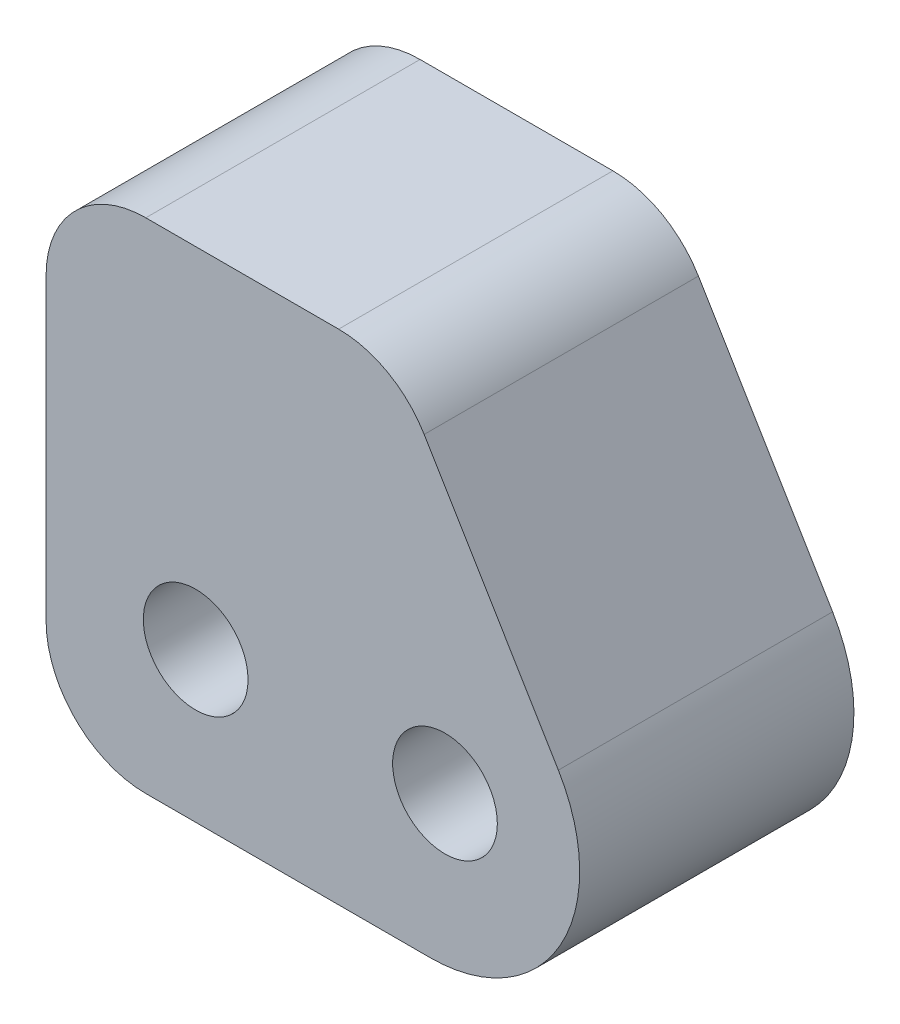
ISO-10303-21;
HEADER;
FILE_DESCRIPTION(('STEP AP214'),'2;1');
FILE_NAME('part.step','',(''),(''),'','','');
FILE_SCHEMA(('AUTOMOTIVE_DESIGN { 1 0 10303 214 1 1 1 1 }'));
ENDSEC;
DATA;
#1=APPLICATION_CONTEXT('core data for automotive mechanical design processes');
#2=APPLICATION_PROTOCOL_DEFINITION('international standard','automotive_design',2000,#1);
#3=PRODUCT_CONTEXT('',#1,'mechanical');
#4=PRODUCT('Part','Part','',(#3));
#5=PRODUCT_RELATED_PRODUCT_CATEGORY('part','',(#4));
#6=PRODUCT_DEFINITION_FORMATION('','',#4);
#7=PRODUCT_DEFINITION_CONTEXT('part definition',#1,'design');
#8=PRODUCT_DEFINITION('design','',#6,#7);
#9=PRODUCT_DEFINITION_SHAPE('','',#8);
#10=(LENGTH_UNIT() NAMED_UNIT(*) SI_UNIT(.MILLI.,.METRE.));
#11=(NAMED_UNIT(*) PLANE_ANGLE_UNIT() SI_UNIT($,.RADIAN.));
#12=(NAMED_UNIT(*) SI_UNIT($,.STERADIAN.) SOLID_ANGLE_UNIT());
#13=UNCERTAINTY_MEASURE_WITH_UNIT(LENGTH_MEASURE(1.E-05),#10,'distance_accuracy_value','');
#14=(GEOMETRIC_REPRESENTATION_CONTEXT(3) GLOBAL_UNCERTAINTY_ASSIGNED_CONTEXT((#13)) GLOBAL_UNIT_ASSIGNED_CONTEXT((#10,
#11,#12)) REPRESENTATION_CONTEXT('',''));
#15=CARTESIAN_POINT('',(0.,0.,0.));
#16=DIRECTION('',(0.,0.,1.));
#17=DIRECTION('',(1.,0.,0.));
#18=AXIS2_PLACEMENT_3D('',#15,#16,#17);
#19=CARTESIAN_POINT('',(0.,0.,5.5));
#20=DIRECTION('',(0.,0.,1.));
#21=DIRECTION('',(1.,0.,0.));
#22=AXIS2_PLACEMENT_3D('',#19,#20,#21);
#23=PLANE('',#22);
#24=CARTESIAN_POINT('',(3.,3.,5.5));
#25=DIRECTION('',(0.,0.,1.));
#26=DIRECTION('',(1.,0.,0.));
#27=AXIS2_PLACEMENT_3D('',#24,#25,#26);
#28=CIRCLE('',#27,1.05);
#29=CARTESIAN_POINT('',(4.05,3.,5.5));
#30=VERTEX_POINT('',#29);
#31=EDGE_CURVE('E161',#30,#30,#28,.T.);
#32=ORIENTED_EDGE('',*,*,#31,.F.);
#33=EDGE_LOOP('',(#32));
#34=FACE_BOUND('',#33,.T.);
#35=DIRECTION('',(-0.514495755427526,0.857492925712544,0.));
#36=VECTOR('',#35,1.);
#37=CARTESIAN_POINT('',(7.,10.,5.5));
#38=LINE('',#37,#36);
#39=CARTESIAN_POINT('',(10.2739076402305,4.54348726628258,5.5));
#40=VERTEX_POINT('',#39);
#41=CARTESIAN_POINT('',(7.58260509348697,9.02899151085505,5.5));
#42=VERTEX_POINT('',#41);
#43=EDGE_CURVE('E119',#40,#42,#38,.T.);
#44=ORIENTED_EDGE('',*,*,#43,.T.);
#45=CARTESIAN_POINT('',(5.86761924206188,8.,5.5));
#46=DIRECTION('',(0.,0.,1.));
#47=DIRECTION('',(1.,0.,0.));
#48=AXIS2_PLACEMENT_3D('',#45,#46,#47);
#49=CIRCLE('',#48,2.);
#50=CARTESIAN_POINT('',(5.86761924206188,10.,5.5));
#51=VERTEX_POINT('',#50);
#52=EDGE_CURVE('E154',#42,#51,#49,.T.);
#53=ORIENTED_EDGE('',*,*,#52,.T.);
#54=DIRECTION('',(-1.,0.,0.));
#55=VECTOR('',#54,1.);
#56=CARTESIAN_POINT('',(0.,10.,5.5));
#57=LINE('',#56,#55);
#58=CARTESIAN_POINT('',(2.,10.,5.5));
#59=VERTEX_POINT('',#58);
#60=EDGE_CURVE('E120',#51,#59,#57,.T.);
#61=ORIENTED_EDGE('',*,*,#60,.T.);
#62=CARTESIAN_POINT('',(2.,8.,5.5));
#63=DIRECTION('',(0.,0.,1.));
#64=DIRECTION('',(1.,0.,0.));
#65=AXIS2_PLACEMENT_3D('',#62,#63,#64);
#66=CIRCLE('',#65,2.);
#67=CARTESIAN_POINT('',(0.,8.,5.5));
#68=VERTEX_POINT('',#67);
#69=EDGE_CURVE('E55',#59,#68,#66,.T.);
#70=ORIENTED_EDGE('',*,*,#69,.T.);
#71=DIRECTION('',(0.,-1.,0.));
#72=VECTOR('',#71,1.);
#73=CARTESIAN_POINT('',(0.,10.,5.5));
#74=LINE('',#73,#72);
#75=CARTESIAN_POINT('',(0.,2.,5.5));
#76=VERTEX_POINT('',#75);
#77=EDGE_CURVE('E130',#68,#76,#74,.T.);
#78=ORIENTED_EDGE('',*,*,#77,.T.);
#79=CARTESIAN_POINT('',(2.,2.,5.5));
#80=DIRECTION('',(0.,0.,1.));
#81=DIRECTION('',(1.,0.,0.));
#82=AXIS2_PLACEMENT_3D('',#79,#80,#81);
#83=CIRCLE('',#82,2.);
#84=CARTESIAN_POINT('',(2.,0.,5.5));
#85=VERTEX_POINT('',#84);
#86=EDGE_CURVE('E151',#76,#85,#83,.T.);
#87=ORIENTED_EDGE('',*,*,#86,.T.);
#88=DIRECTION('',(1.,0.,0.));
#89=VECTOR('',#88,1.);
#90=CARTESIAN_POINT('',(0.,0.,5.5));
#91=LINE('',#90,#89);
#92=CARTESIAN_POINT('',(7.70142886309282,0.,5.5));
#93=VERTEX_POINT('',#92);
#94=EDGE_CURVE('E168',#85,#93,#91,.T.);
#95=ORIENTED_EDGE('',*,*,#94,.T.);
#96=CARTESIAN_POINT('',(7.70142886309282,3.,5.5));
#97=DIRECTION('',(0.,0.,1.));
#98=DIRECTION('',(1.,0.,0.));
#99=AXIS2_PLACEMENT_3D('',#96,#97,#98);
#100=CIRCLE('',#99,3.);
#101=EDGE_CURVE('E137',#93,#40,#100,.T.);
#102=ORIENTED_EDGE('',*,*,#101,.T.);
#103=EDGE_LOOP('',(#44,#53,#61,#70,#78,#87,#95,#102));
#104=FACE_BOUND('',#103,.T.);
#105=CARTESIAN_POINT('',(8.,3.,5.5));
#106=DIRECTION('',(0.,0.,1.));
#107=DIRECTION('',(1.,0.,0.));
#108=AXIS2_PLACEMENT_3D('',#105,#106,#107);
#109=CIRCLE('',#108,1.05);
#110=CARTESIAN_POINT('',(9.05,3.,5.5));
#111=VERTEX_POINT('',#110);
#112=EDGE_CURVE('E172',#111,#111,#109,.T.);
#113=ORIENTED_EDGE('',*,*,#112,.F.);
#114=EDGE_LOOP('',(#113));
#115=FACE_BOUND('',#114,.T.);
#116=ADVANCED_FACE('F33',(#34,#104,#115),#23,.T.);
#117=CARTESIAN_POINT('',(0.,0.,0.));
#118=DIRECTION('',(0.,0.,1.));
#119=DIRECTION('',(1.,0.,0.));
#120=AXIS2_PLACEMENT_3D('',#117,#118,#119);
#121=PLANE('',#120);
#122=DIRECTION('',(-1.,0.,0.));
#123=VECTOR('',#122,1.);
#124=CARTESIAN_POINT('',(0.,10.,0.));
#125=LINE('',#124,#123);
#126=CARTESIAN_POINT('',(5.86761924206188,10.,0.));
#127=VERTEX_POINT('',#126);
#128=CARTESIAN_POINT('',(2.,10.,0.));
#129=VERTEX_POINT('',#128);
#130=EDGE_CURVE('E126',#127,#129,#125,.T.);
#131=ORIENTED_EDGE('',*,*,#130,.F.);
#132=CARTESIAN_POINT('',(5.86761924206188,8.,0.));
#133=DIRECTION('',(0.,0.,1.));
#134=DIRECTION('',(1.,0.,0.));
#135=AXIS2_PLACEMENT_3D('',#132,#133,#134);
#136=CIRCLE('',#135,2.);
#137=CARTESIAN_POINT('',(7.58260509348697,9.02899151085505,0.));
#138=VERTEX_POINT('',#137);
#139=EDGE_CURVE('E125',#127,#138,#136,.F.);
#140=ORIENTED_EDGE('',*,*,#139,.T.);
#141=DIRECTION('',(-0.514495755427526,0.857492925712544,0.));
#142=VECTOR('',#141,1.);
#143=CARTESIAN_POINT('',(7.,10.,0.));
#144=LINE('',#143,#142);
#145=CARTESIAN_POINT('',(10.2739076402305,4.54348726628258,0.));
#146=VERTEX_POINT('',#145);
#147=EDGE_CURVE('E116',#146,#138,#144,.T.);
#148=ORIENTED_EDGE('',*,*,#147,.F.);
#149=CARTESIAN_POINT('',(7.70142886309282,3.,0.));
#150=DIRECTION('',(0.,0.,1.));
#151=DIRECTION('',(1.,0.,0.));
#152=AXIS2_PLACEMENT_3D('',#149,#150,#151);
#153=CIRCLE('',#152,3.);
#154=CARTESIAN_POINT('',(7.70142886309282,0.,0.));
#155=VERTEX_POINT('',#154);
#156=EDGE_CURVE('E101',#146,#155,#153,.F.);
#157=ORIENTED_EDGE('',*,*,#156,.T.);
#158=DIRECTION('',(1.,0.,0.));
#159=VECTOR('',#158,1.);
#160=CARTESIAN_POINT('',(0.,0.,0.));
#161=LINE('',#160,#159);
#162=CARTESIAN_POINT('',(2.,0.,0.));
#163=VERTEX_POINT('',#162);
#164=EDGE_CURVE('E127',#163,#155,#161,.T.);
#165=ORIENTED_EDGE('',*,*,#164,.F.);
#166=CARTESIAN_POINT('',(2.,2.,0.));
#167=DIRECTION('',(0.,0.,1.));
#168=DIRECTION('',(1.,0.,0.));
#169=AXIS2_PLACEMENT_3D('',#166,#167,#168);
#170=CIRCLE('',#169,2.);
#171=CARTESIAN_POINT('',(0.,2.,0.));
#172=VERTEX_POINT('',#171);
#173=EDGE_CURVE('E144',#163,#172,#170,.F.);
#174=ORIENTED_EDGE('',*,*,#173,.T.);
#175=DIRECTION('',(0.,-1.,0.));
#176=VECTOR('',#175,1.);
#177=CARTESIAN_POINT('',(0.,10.,0.));
#178=LINE('',#177,#176);
#179=CARTESIAN_POINT('',(0.,8.,0.));
#180=VERTEX_POINT('',#179);
#181=EDGE_CURVE('E132',#180,#172,#178,.T.);
#182=ORIENTED_EDGE('',*,*,#181,.F.);
#183=CARTESIAN_POINT('',(2.,8.,0.));
#184=DIRECTION('',(0.,0.,1.));
#185=DIRECTION('',(1.,0.,0.));
#186=AXIS2_PLACEMENT_3D('',#183,#184,#185);
#187=CIRCLE('',#186,2.);
#188=EDGE_CURVE('E146',#180,#129,#187,.F.);
#189=ORIENTED_EDGE('',*,*,#188,.T.);
#190=EDGE_LOOP('',(#131,#140,#148,#157,#165,#174,#182,#189));
#191=FACE_BOUND('',#190,.T.);
#192=CARTESIAN_POINT('',(3.,3.,0.));
#193=DIRECTION('',(0.,0.,1.));
#194=DIRECTION('',(1.,0.,0.));
#195=AXIS2_PLACEMENT_3D('',#192,#193,#194);
#196=CIRCLE('',#195,1.05);
#197=CARTESIAN_POINT('',(4.05,3.,0.));
#198=VERTEX_POINT('',#197);
#199=EDGE_CURVE('E163',#198,#198,#196,.T.);
#200=ORIENTED_EDGE('',*,*,#199,.T.);
#201=EDGE_LOOP('',(#200));
#202=FACE_BOUND('',#201,.T.);
#203=CARTESIAN_POINT('',(8.,3.,0.));
#204=DIRECTION('',(0.,0.,1.));
#205=DIRECTION('',(1.,0.,0.));
#206=AXIS2_PLACEMENT_3D('',#203,#204,#205);
#207=CIRCLE('',#206,1.05);
#208=CARTESIAN_POINT('',(9.05,3.,0.));
#209=VERTEX_POINT('',#208);
#210=EDGE_CURVE('E174',#209,#209,#207,.T.);
#211=ORIENTED_EDGE('',*,*,#210,.T.);
#212=EDGE_LOOP('',(#211));
#213=FACE_BOUND('',#212,.T.);
#214=ADVANCED_FACE('F123',(#191,#202,#213),#121,.F.);
#215=CARTESIAN_POINT('',(0.,10.,5.5));
#216=DIRECTION('',(1.,0.,0.));
#217=DIRECTION('',(0.,1.,0.));
#218=AXIS2_PLACEMENT_3D('',#215,#216,#217);
#219=PLANE('',#218);
#220=ORIENTED_EDGE('',*,*,#77,.F.);
#221=DIRECTION('',(0.,0.,-1.));
#222=VECTOR('',#221,1.);
#223=CARTESIAN_POINT('',(0.,8.,5.5));
#224=LINE('',#223,#222);
#225=EDGE_CURVE('E41',#68,#180,#224,.T.);
#226=ORIENTED_EDGE('',*,*,#225,.T.);
#227=ORIENTED_EDGE('',*,*,#181,.T.);
#228=DIRECTION('',(0.,0.,-1.));
#229=VECTOR('',#228,1.);
#230=CARTESIAN_POINT('',(0.,2.,5.5));
#231=LINE('',#230,#229);
#232=EDGE_CURVE('E48',#172,#76,#231,.F.);
#233=ORIENTED_EDGE('',*,*,#232,.T.);
#234=EDGE_LOOP('',(#220,#226,#227,#233));
#235=FACE_BOUND('',#234,.T.);
#236=ADVANCED_FACE('F159',(#235),#219,.F.);
#237=CARTESIAN_POINT('',(0.,0.,5.5));
#238=DIRECTION('',(0.,1.,0.));
#239=DIRECTION('',(0.,0.,1.));
#240=AXIS2_PLACEMENT_3D('',#237,#238,#239);
#241=PLANE('',#240);
#242=ORIENTED_EDGE('',*,*,#94,.F.);
#243=DIRECTION('',(0.,0.,-1.));
#244=VECTOR('',#243,1.);
#245=CARTESIAN_POINT('',(2.,0.,5.5));
#246=LINE('',#245,#244);
#247=EDGE_CURVE('E11',#85,#163,#246,.T.);
#248=ORIENTED_EDGE('',*,*,#247,.T.);
#249=ORIENTED_EDGE('',*,*,#164,.T.);
#250=DIRECTION('',(0.,0.,-1.));
#251=VECTOR('',#250,1.);
#252=CARTESIAN_POINT('',(7.70142886309282,0.,5.5));
#253=LINE('',#252,#251);
#254=EDGE_CURVE('E107',#155,#93,#253,.F.);
#255=ORIENTED_EDGE('',*,*,#254,.T.);
#256=EDGE_LOOP('',(#242,#248,#249,#255));
#257=FACE_BOUND('',#256,.T.);
#258=ADVANCED_FACE('F201',(#257),#241,.F.);
#259=CARTESIAN_POINT('',(7.,10.,5.5));
#260=DIRECTION('',(-0.857492925712544,-0.514495755427526,0.));
#261=DIRECTION('',(0.514495755427526,-0.857492925712544,0.));
#262=AXIS2_PLACEMENT_3D('',#259,#260,#261);
#263=PLANE('',#262);
#264=ORIENTED_EDGE('',*,*,#147,.T.);
#265=DIRECTION('',(0.,0.,-1.));
#266=VECTOR('',#265,1.);
#267=CARTESIAN_POINT('',(7.58260509348697,9.02899151085505,5.5));
#268=LINE('',#267,#266);
#269=EDGE_CURVE('E149',#138,#42,#268,.F.);
#270=ORIENTED_EDGE('',*,*,#269,.T.);
#271=ORIENTED_EDGE('',*,*,#43,.F.);
#272=DIRECTION('',(0.,0.,-1.));
#273=VECTOR('',#272,1.);
#274=CARTESIAN_POINT('',(10.2739076402305,4.54348726628258,5.5));
#275=LINE('',#274,#273);
#276=EDGE_CURVE('E105',#40,#146,#275,.T.);
#277=ORIENTED_EDGE('',*,*,#276,.T.);
#278=EDGE_LOOP('',(#264,#270,#271,#277));
#279=FACE_BOUND('',#278,.T.);
#280=ADVANCED_FACE('F115',(#279),#263,.F.);
#281=CARTESIAN_POINT('',(0.,10.,5.5));
#282=DIRECTION('',(0.,-1.,0.));
#283=DIRECTION('',(0.,0.,-1.));
#284=AXIS2_PLACEMENT_3D('',#281,#282,#283);
#285=PLANE('',#284);
#286=ORIENTED_EDGE('',*,*,#60,.F.);
#287=DIRECTION('',(0.,0.,-1.));
#288=VECTOR('',#287,1.);
#289=CARTESIAN_POINT('',(5.86761924206188,10.,5.5));
#290=LINE('',#289,#288);
#291=EDGE_CURVE('E141',#51,#127,#290,.T.);
#292=ORIENTED_EDGE('',*,*,#291,.T.);
#293=ORIENTED_EDGE('',*,*,#130,.T.);
#294=DIRECTION('',(0.,0.,-1.));
#295=VECTOR('',#294,1.);
#296=CARTESIAN_POINT('',(2.,10.,5.5));
#297=LINE('',#296,#295);
#298=EDGE_CURVE('E139',#129,#59,#297,.F.);
#299=ORIENTED_EDGE('',*,*,#298,.T.);
#300=EDGE_LOOP('',(#286,#292,#293,#299));
#301=FACE_BOUND('',#300,.T.);
#302=ADVANCED_FACE('F195',(#301),#285,.F.);
#303=CARTESIAN_POINT('',(3.,3.,5.5));
#304=DIRECTION('',(0.,0.,-1.));
#305=DIRECTION('',(-1.,0.,0.));
#306=AXIS2_PLACEMENT_3D('',#303,#304,#305);
#307=CYLINDRICAL_SURFACE('',#306,1.05);
#308=ORIENTED_EDGE('',*,*,#31,.T.);
#309=EDGE_LOOP('',(#308));
#310=FACE_BOUND('',#309,.T.);
#311=ORIENTED_EDGE('',*,*,#199,.F.);
#312=EDGE_LOOP('',(#311));
#313=FACE_BOUND('',#312,.T.);
#314=ADVANCED_FACE('F192',(#310,#313),#307,.F.);
#315=CARTESIAN_POINT('',(8.,3.,5.5));
#316=DIRECTION('',(0.,0.,-1.));
#317=DIRECTION('',(-1.,0.,0.));
#318=AXIS2_PLACEMENT_3D('',#315,#316,#317);
#319=CYLINDRICAL_SURFACE('',#318,1.05);
#320=ORIENTED_EDGE('',*,*,#112,.T.);
#321=EDGE_LOOP('',(#320));
#322=FACE_BOUND('',#321,.T.);
#323=ORIENTED_EDGE('',*,*,#210,.F.);
#324=EDGE_LOOP('',(#323));
#325=FACE_BOUND('',#324,.T.);
#326=ADVANCED_FACE('F180',(#322,#325),#319,.F.);
#327=CARTESIAN_POINT('',(7.70142886309282,3.,5.5));
#328=DIRECTION('',(0.,0.,-1.));
#329=DIRECTION('',(-1.,0.,0.));
#330=AXIS2_PLACEMENT_3D('',#327,#328,#329);
#331=CYLINDRICAL_SURFACE('',#330,3.);
#332=ORIENTED_EDGE('',*,*,#101,.F.);
#333=ORIENTED_EDGE('',*,*,#254,.F.);
#334=ORIENTED_EDGE('',*,*,#156,.F.);
#335=ORIENTED_EDGE('',*,*,#276,.F.);
#336=EDGE_LOOP('',(#332,#333,#334,#335));
#337=FACE_BOUND('',#336,.T.);
#338=ADVANCED_FACE('F104',(#337),#331,.T.);
#339=CARTESIAN_POINT('',(5.86761924206188,8.,5.5));
#340=DIRECTION('',(0.,0.,-1.));
#341=DIRECTION('',(-1.,0.,0.));
#342=AXIS2_PLACEMENT_3D('',#339,#340,#341);
#343=CYLINDRICAL_SURFACE('',#342,2.);
#344=ORIENTED_EDGE('',*,*,#52,.F.);
#345=ORIENTED_EDGE('',*,*,#269,.F.);
#346=ORIENTED_EDGE('',*,*,#139,.F.);
#347=ORIENTED_EDGE('',*,*,#291,.F.);
#348=EDGE_LOOP('',(#344,#345,#346,#347));
#349=FACE_BOUND('',#348,.T.);
#350=ADVANCED_FACE('F209',(#349),#343,.T.);
#351=CARTESIAN_POINT('',(2.,8.,5.5));
#352=DIRECTION('',(0.,0.,-1.));
#353=DIRECTION('',(-1.,0.,0.));
#354=AXIS2_PLACEMENT_3D('',#351,#352,#353);
#355=CYLINDRICAL_SURFACE('',#354,2.);
#356=ORIENTED_EDGE('',*,*,#69,.F.);
#357=ORIENTED_EDGE('',*,*,#298,.F.);
#358=ORIENTED_EDGE('',*,*,#188,.F.);
#359=ORIENTED_EDGE('',*,*,#225,.F.);
#360=EDGE_LOOP('',(#356,#357,#358,#359));
#361=FACE_BOUND('',#360,.T.);
#362=ADVANCED_FACE('F211',(#361),#355,.T.);
#363=CARTESIAN_POINT('',(2.,2.,5.5));
#364=DIRECTION('',(0.,0.,-1.));
#365=DIRECTION('',(-1.,0.,0.));
#366=AXIS2_PLACEMENT_3D('',#363,#364,#365);
#367=CYLINDRICAL_SURFACE('',#366,2.);
#368=ORIENTED_EDGE('',*,*,#86,.F.);
#369=ORIENTED_EDGE('',*,*,#232,.F.);
#370=ORIENTED_EDGE('',*,*,#173,.F.);
#371=ORIENTED_EDGE('',*,*,#247,.F.);
#372=EDGE_LOOP('',(#368,#369,#370,#371));
#373=FACE_BOUND('',#372,.T.);
#374=ADVANCED_FACE('F35',(#373),#367,.T.);
#375=CLOSED_SHELL('',(#116,#214,#236,#258,#280,#302,#314,#326,#338,#350,#362,#374));
#376=MANIFOLD_SOLID_BREP('B2',#375);
#377=ADVANCED_BREP_SHAPE_REPRESENTATION('',(#18,#376),#14);
#378=SHAPE_DEFINITION_REPRESENTATION(#9,#377);
ENDSEC;
END-ISO-10303-21;
